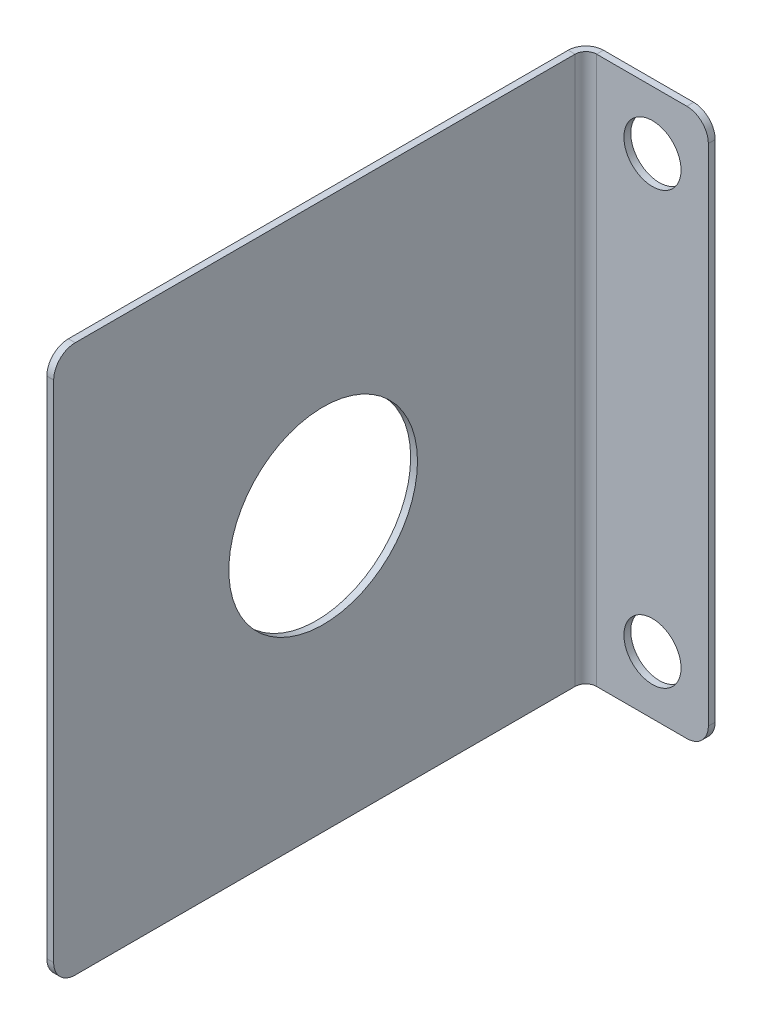
ISO-10303-21;
HEADER;
FILE_DESCRIPTION(('STEP AP214'),'2;1');
FILE_NAME('part.step','',(''),(''),'','','');
FILE_SCHEMA(('AUTOMOTIVE_DESIGN { 1 0 10303 214 1 1 1 1 }'));
ENDSEC;
DATA;
#1=APPLICATION_CONTEXT('core data for automotive mechanical design processes');
#2=APPLICATION_PROTOCOL_DEFINITION('international standard','automotive_design',2000,#1);
#3=PRODUCT_CONTEXT('',#1,'mechanical');
#4=PRODUCT('Part','Part','',(#3));
#5=PRODUCT_RELATED_PRODUCT_CATEGORY('part','',(#4));
#6=PRODUCT_DEFINITION_FORMATION('','',#4);
#7=PRODUCT_DEFINITION_CONTEXT('part definition',#1,'design');
#8=PRODUCT_DEFINITION('design','',#6,#7);
#9=PRODUCT_DEFINITION_SHAPE('','',#8);
#10=(LENGTH_UNIT() NAMED_UNIT(*) SI_UNIT(.MILLI.,.METRE.));
#11=(NAMED_UNIT(*) PLANE_ANGLE_UNIT() SI_UNIT($,.RADIAN.));
#12=(NAMED_UNIT(*) SI_UNIT($,.STERADIAN.) SOLID_ANGLE_UNIT());
#13=UNCERTAINTY_MEASURE_WITH_UNIT(LENGTH_MEASURE(1.E-05),#10,'distance_accuracy_value','');
#14=(GEOMETRIC_REPRESENTATION_CONTEXT(3) GLOBAL_UNCERTAINTY_ASSIGNED_CONTEXT((#13)) GLOBAL_UNIT_ASSIGNED_CONTEXT((#10,
#11,#12)) REPRESENTATION_CONTEXT('',''));
#15=CARTESIAN_POINT('',(0.,0.,0.));
#16=DIRECTION('',(0.,0.,1.));
#17=DIRECTION('',(1.,0.,0.));
#18=AXIS2_PLACEMENT_3D('',#15,#16,#17);
#19=CARTESIAN_POINT('',(-0.635,25.4,25.));
#20=DIRECTION('',(0.,1.,0.));
#21=DIRECTION('',(0.,0.,1.));
#22=AXIS2_PLACEMENT_3D('',#19,#20,#21);
#23=PLANE('',#22);
#24=DIRECTION('',(0.,0.,1.));
#25=VECTOR('',#24,1.);
#26=CARTESIAN_POINT('',(-0.635,25.4,25.));
#27=LINE('',#26,#25);
#28=CARTESIAN_POINT('',(-0.635000000000004,25.4,-23.365));
#29=VERTEX_POINT('',#28);
#30=CARTESIAN_POINT('',(-0.635,25.4,23.));
#31=VERTEX_POINT('',#30);
#32=EDGE_CURVE('E226',#29,#31,#27,.T.);
#33=ORIENTED_EDGE('',*,*,#32,.T.);
#34=DIRECTION('',(1.,0.,0.));
#35=VECTOR('',#34,1.);
#36=CARTESIAN_POINT('',(-0.635,25.4,23.));
#37=LINE('',#36,#35);
#38=CARTESIAN_POINT('',(0.,25.4,23.));
#39=VERTEX_POINT('',#38);
#40=EDGE_CURVE('E257',#31,#39,#37,.T.);
#41=ORIENTED_EDGE('',*,*,#40,.T.);
#42=DIRECTION('',(0.,0.,1.));
#43=VECTOR('',#42,1.);
#44=CARTESIAN_POINT('',(0.,25.4,25.));
#45=LINE('',#44,#43);
#46=CARTESIAN_POINT('',(0.,25.4,-23.365));
#47=VERTEX_POINT('',#46);
#48=EDGE_CURVE('E223',#47,#39,#45,.T.);
#49=ORIENTED_EDGE('',*,*,#48,.F.);
#50=DIRECTION('',(-1.,0.,0.));
#51=VECTOR('',#50,1.);
#52=CARTESIAN_POINT('',(0.,25.4,-23.365));
#53=LINE('',#52,#51);
#54=EDGE_CURVE('E207',#47,#29,#53,.T.);
#55=ORIENTED_EDGE('',*,*,#54,.T.);
#56=EDGE_LOOP('',(#33,#41,#49,#55));
#57=FACE_BOUND('',#56,.T.);
#58=ADVANCED_FACE('F61',(#57),#23,.T.);
#59=CARTESIAN_POINT('',(-0.635,0.,0.));
#60=DIRECTION('',(-1.,0.,0.));
#61=DIRECTION('',(0.,0.,1.));
#62=AXIS2_PLACEMENT_3D('',#59,#60,#61);
#63=PLANE('',#62);
#64=CARTESIAN_POINT('',(-0.635,0.,0.));
#65=DIRECTION('',(1.,0.,0.));
#66=DIRECTION('',(0.,0.,-1.));
#67=AXIS2_PLACEMENT_3D('',#64,#65,#66);
#68=CIRCLE('',#67,8.75);
#69=CARTESIAN_POINT('',(-0.635,0.,-8.75));
#70=VERTEX_POINT('',#69);
#71=EDGE_CURVE('E220',#70,#70,#68,.T.);
#72=ORIENTED_EDGE('',*,*,#71,.T.);
#73=EDGE_LOOP('',(#72));
#74=FACE_BOUND('',#73,.T.);
#75=DIRECTION('',(0.,-1.,0.));
#76=VECTOR('',#75,1.);
#77=CARTESIAN_POINT('',(-0.635,-25.4,25.));
#78=LINE('',#77,#76);
#79=CARTESIAN_POINT('',(-0.635,23.4,25.));
#80=VERTEX_POINT('',#79);
#81=CARTESIAN_POINT('',(-0.635,-23.4,25.));
#82=VERTEX_POINT('',#81);
#83=EDGE_CURVE('E229',#80,#82,#78,.T.);
#84=ORIENTED_EDGE('',*,*,#83,.F.);
#85=CARTESIAN_POINT('',(-0.635,23.4,23.));
#86=DIRECTION('',(-1.,0.,0.));
#87=DIRECTION('',(0.,0.,1.));
#88=AXIS2_PLACEMENT_3D('',#85,#86,#87);
#89=CIRCLE('',#88,2.);
#90=EDGE_CURVE('E69',#80,#31,#89,.T.);
#91=ORIENTED_EDGE('',*,*,#90,.T.);
#92=ORIENTED_EDGE('',*,*,#32,.F.);
#93=DIRECTION('',(0.,1.,0.));
#94=VECTOR('',#93,1.);
#95=CARTESIAN_POINT('',(-0.635000000000004,25.4,-23.365));
#96=LINE('',#95,#94);
#97=CARTESIAN_POINT('',(-0.635,-25.4,-23.365));
#98=VERTEX_POINT('',#97);
#99=EDGE_CURVE('E158',#29,#98,#96,.F.);
#100=ORIENTED_EDGE('',*,*,#99,.T.);
#101=DIRECTION('',(0.,0.,-1.));
#102=VECTOR('',#101,1.);
#103=CARTESIAN_POINT('',(-0.635,-25.4,25.));
#104=LINE('',#103,#102);
#105=CARTESIAN_POINT('',(-0.635,-25.4,23.));
#106=VERTEX_POINT('',#105);
#107=EDGE_CURVE('E232',#106,#98,#104,.T.);
#108=ORIENTED_EDGE('',*,*,#107,.F.);
#109=CARTESIAN_POINT('',(-0.635,-23.4,23.));
#110=DIRECTION('',(-1.,0.,0.));
#111=DIRECTION('',(0.,0.,1.));
#112=AXIS2_PLACEMENT_3D('',#109,#110,#111);
#113=CIRCLE('',#112,2.);
#114=EDGE_CURVE('E81',#106,#82,#113,.T.);
#115=ORIENTED_EDGE('',*,*,#114,.T.);
#116=EDGE_LOOP('',(#84,#91,#92,#100,#108,#115));
#117=FACE_BOUND('',#116,.T.);
#118=ADVANCED_FACE('F271',(#74,#117),#63,.T.);
#119=CARTESIAN_POINT('',(0.,0.,0.));
#120=DIRECTION('',(-1.,0.,0.));
#121=DIRECTION('',(0.,0.,1.));
#122=AXIS2_PLACEMENT_3D('',#119,#120,#121);
#123=PLANE('',#122);
#124=CARTESIAN_POINT('',(0.,0.,0.));
#125=DIRECTION('',(1.,0.,0.));
#126=DIRECTION('',(0.,0.,-1.));
#127=AXIS2_PLACEMENT_3D('',#124,#125,#126);
#128=CIRCLE('',#127,8.75);
#129=CARTESIAN_POINT('',(0.,0.,-8.75));
#130=VERTEX_POINT('',#129);
#131=EDGE_CURVE('E218',#130,#130,#128,.T.);
#132=ORIENTED_EDGE('',*,*,#131,.F.);
#133=EDGE_LOOP('',(#132));
#134=FACE_BOUND('',#133,.T.);
#135=ORIENTED_EDGE('',*,*,#48,.T.);
#136=CARTESIAN_POINT('',(0.,23.4,23.));
#137=DIRECTION('',(-1.,0.,0.));
#138=DIRECTION('',(0.,0.,1.));
#139=AXIS2_PLACEMENT_3D('',#136,#137,#138);
#140=CIRCLE('',#139,2.);
#141=CARTESIAN_POINT('',(0.,23.4,25.));
#142=VERTEX_POINT('',#141);
#143=EDGE_CURVE('E262',#39,#142,#140,.F.);
#144=ORIENTED_EDGE('',*,*,#143,.T.);
#145=DIRECTION('',(0.,-1.,0.));
#146=VECTOR('',#145,1.);
#147=CARTESIAN_POINT('',(0.,-25.4,25.));
#148=LINE('',#147,#146);
#149=CARTESIAN_POINT('',(0.,-23.4,25.));
#150=VERTEX_POINT('',#149);
#151=EDGE_CURVE('E237',#142,#150,#148,.T.);
#152=ORIENTED_EDGE('',*,*,#151,.T.);
#153=CARTESIAN_POINT('',(0.,-23.4,23.));
#154=DIRECTION('',(-1.,0.,0.));
#155=DIRECTION('',(0.,0.,1.));
#156=AXIS2_PLACEMENT_3D('',#153,#154,#155);
#157=CIRCLE('',#156,2.);
#158=CARTESIAN_POINT('',(0.,-25.4,23.));
#159=VERTEX_POINT('',#158);
#160=EDGE_CURVE('E260',#150,#159,#157,.F.);
#161=ORIENTED_EDGE('',*,*,#160,.T.);
#162=DIRECTION('',(0.,0.,-1.));
#163=VECTOR('',#162,1.);
#164=CARTESIAN_POINT('',(0.,-25.4,25.));
#165=LINE('',#164,#163);
#166=CARTESIAN_POINT('',(0.,-25.4,-23.365));
#167=VERTEX_POINT('',#166);
#168=EDGE_CURVE('E230',#159,#167,#165,.T.);
#169=ORIENTED_EDGE('',*,*,#168,.T.);
#170=DIRECTION('',(0.,1.,0.));
#171=VECTOR('',#170,1.);
#172=CARTESIAN_POINT('',(0.,25.4,-23.365));
#173=LINE('',#172,#171);
#174=EDGE_CURVE('E211',#47,#167,#173,.F.);
#175=ORIENTED_EDGE('',*,*,#174,.F.);
#176=EDGE_LOOP('',(#135,#144,#152,#161,#169,#175));
#177=FACE_BOUND('',#176,.T.);
#178=ADVANCED_FACE('F280',(#134,#177),#123,.F.);
#179=CARTESIAN_POINT('',(-0.635,-25.4,25.));
#180=DIRECTION('',(0.,-1.,0.));
#181=DIRECTION('',(0.,0.,-1.));
#182=AXIS2_PLACEMENT_3D('',#179,#180,#181);
#183=PLANE('',#182);
#184=ORIENTED_EDGE('',*,*,#168,.F.);
#185=DIRECTION('',(1.,0.,0.));
#186=VECTOR('',#185,1.);
#187=CARTESIAN_POINT('',(-0.635,-25.4,23.));
#188=LINE('',#187,#186);
#189=EDGE_CURVE('E13',#159,#106,#188,.F.);
#190=ORIENTED_EDGE('',*,*,#189,.T.);
#191=ORIENTED_EDGE('',*,*,#107,.T.);
#192=DIRECTION('',(-1.,0.,0.));
#193=VECTOR('',#192,1.);
#194=CARTESIAN_POINT('',(0.,-25.4,-23.365));
#195=LINE('',#194,#193);
#196=EDGE_CURVE('E215',#167,#98,#195,.T.);
#197=ORIENTED_EDGE('',*,*,#196,.F.);
#198=EDGE_LOOP('',(#184,#190,#191,#197));
#199=FACE_BOUND('',#198,.T.);
#200=ADVANCED_FACE('F287',(#199),#183,.T.);
#201=CARTESIAN_POINT('',(-0.635,-25.4,25.));
#202=DIRECTION('',(0.,0.,1.));
#203=DIRECTION('',(1.,0.,0.));
#204=AXIS2_PLACEMENT_3D('',#201,#202,#203);
#205=PLANE('',#204);
#206=ORIENTED_EDGE('',*,*,#151,.F.);
#207=DIRECTION('',(1.,0.,0.));
#208=VECTOR('',#207,1.);
#209=CARTESIAN_POINT('',(-0.635,23.4,25.));
#210=LINE('',#209,#208);
#211=EDGE_CURVE('E267',#142,#80,#210,.F.);
#212=ORIENTED_EDGE('',*,*,#211,.T.);
#213=ORIENTED_EDGE('',*,*,#83,.T.);
#214=DIRECTION('',(1.,0.,0.));
#215=VECTOR('',#214,1.);
#216=CARTESIAN_POINT('',(-0.635,-23.4,25.));
#217=LINE('',#216,#215);
#218=EDGE_CURVE('E264',#82,#150,#217,.T.);
#219=ORIENTED_EDGE('',*,*,#218,.T.);
#220=EDGE_LOOP('',(#206,#212,#213,#219));
#221=FACE_BOUND('',#220,.T.);
#222=ADVANCED_FACE('F283',(#221),#205,.T.);
#223=CARTESIAN_POINT('',(-0.635,0.,0.));
#224=DIRECTION('',(1.,0.,0.));
#225=DIRECTION('',(0.,0.,-1.));
#226=AXIS2_PLACEMENT_3D('',#223,#224,#225);
#227=CYLINDRICAL_SURFACE('',#226,8.75);
#228=ORIENTED_EDGE('',*,*,#71,.F.);
#229=EDGE_LOOP('',(#228));
#230=FACE_BOUND('',#229,.T.);
#231=ORIENTED_EDGE('',*,*,#131,.T.);
#232=EDGE_LOOP('',(#231));
#233=FACE_BOUND('',#232,.T.);
#234=ADVANCED_FACE('F454',(#230,#233),#227,.F.);
#235=CARTESIAN_POINT('',(0.999999999999997,-25.4,-23.365));
#236=DIRECTION('',(0.,-1.,0.));
#237=DIRECTION('',(0.,0.,-1.));
#238=AXIS2_PLACEMENT_3D('',#235,#236,#237);
#239=PLANE('',#238);
#240=DIRECTION('',(0.,0.,1.));
#241=VECTOR('',#240,1.);
#242=CARTESIAN_POINT('',(0.999999999999997,-25.4,-25.));
#243=LINE('',#242,#241);
#244=CARTESIAN_POINT('',(0.999999999999994,-25.4,-24.365));
#245=VERTEX_POINT('',#244);
#246=CARTESIAN_POINT('',(0.999999999999992,-25.4,-25.));
#247=VERTEX_POINT('',#246);
#248=EDGE_CURVE('E201',#245,#247,#243,.F.);
#249=ORIENTED_EDGE('',*,*,#248,.F.);
#250=CARTESIAN_POINT('',(0.999999999999997,-25.4,-23.365));
#251=DIRECTION('',(0.,1.,0.));
#252=DIRECTION('',(0.,0.,1.));
#253=AXIS2_PLACEMENT_3D('',#250,#251,#252);
#254=CIRCLE('',#253,1.);
#255=EDGE_CURVE('E161',#167,#245,#254,.F.);
#256=ORIENTED_EDGE('',*,*,#255,.F.);
#257=ORIENTED_EDGE('',*,*,#196,.T.);
#258=CARTESIAN_POINT('',(0.999999999999997,-25.4,-23.365));
#259=DIRECTION('',(0.,1.,0.));
#260=DIRECTION('',(0.,0.,1.));
#261=AXIS2_PLACEMENT_3D('',#258,#259,#260);
#262=CIRCLE('',#261,1.635);
#263=EDGE_CURVE('E206',#98,#247,#262,.F.);
#264=ORIENTED_EDGE('',*,*,#263,.T.);
#265=EDGE_LOOP('',(#249,#256,#257,#264));
#266=FACE_BOUND('',#265,.T.);
#267=ADVANCED_FACE('F291',(#266),#239,.T.);
#268=CARTESIAN_POINT('',(0.999999999999997,25.4,-23.365));
#269=DIRECTION('',(0.,-1.,0.));
#270=DIRECTION('',(0.,0.,-1.));
#271=AXIS2_PLACEMENT_3D('',#268,#269,#270);
#272=PLANE('',#271);
#273=CARTESIAN_POINT('',(0.999999999999997,25.4,-23.365));
#274=DIRECTION('',(0.,1.,0.));
#275=DIRECTION('',(0.,0.,1.));
#276=AXIS2_PLACEMENT_3D('',#273,#274,#275);
#277=CIRCLE('',#276,1.);
#278=CARTESIAN_POINT('',(0.999999999999994,25.4,-24.365));
#279=VERTEX_POINT('',#278);
#280=EDGE_CURVE('E168',#279,#47,#277,.T.);
#281=ORIENTED_EDGE('',*,*,#280,.F.);
#282=DIRECTION('',(0.,0.,1.));
#283=VECTOR('',#282,1.);
#284=CARTESIAN_POINT('',(0.999999999999997,25.4,-24.365));
#285=LINE('',#284,#283);
#286=CARTESIAN_POINT('',(0.999999999999997,25.4,-25.));
#287=VERTEX_POINT('',#286);
#288=EDGE_CURVE('E165',#279,#287,#285,.F.);
#289=ORIENTED_EDGE('',*,*,#288,.T.);
#290=CARTESIAN_POINT('',(0.999999999999997,25.4,-23.365));
#291=DIRECTION('',(0.,1.,0.));
#292=DIRECTION('',(0.,0.,1.));
#293=AXIS2_PLACEMENT_3D('',#290,#291,#292);
#294=CIRCLE('',#293,1.635);
#295=EDGE_CURVE('E150',#287,#29,#294,.T.);
#296=ORIENTED_EDGE('',*,*,#295,.T.);
#297=ORIENTED_EDGE('',*,*,#54,.F.);
#298=EDGE_LOOP('',(#281,#289,#296,#297));
#299=FACE_BOUND('',#298,.T.);
#300=ADVANCED_FACE('F166',(#299),#272,.F.);
#301=CARTESIAN_POINT('',(0.999999999999997,25.4,-23.365));
#302=DIRECTION('',(0.,1.,0.));
#303=DIRECTION('',(0.,0.,-1.));
#304=AXIS2_PLACEMENT_3D('',#301,#302,#303);
#305=CYLINDRICAL_SURFACE('',#304,1.635);
#306=ORIENTED_EDGE('',*,*,#99,.F.);
#307=ORIENTED_EDGE('',*,*,#295,.F.);
#308=DIRECTION('',(0.,1.,0.));
#309=VECTOR('',#308,1.);
#310=CARTESIAN_POINT('',(0.999999999999997,-25.4,-25.));
#311=LINE('',#310,#309);
#312=EDGE_CURVE('E155',#287,#247,#311,.F.);
#313=ORIENTED_EDGE('',*,*,#312,.T.);
#314=ORIENTED_EDGE('',*,*,#263,.F.);
#315=EDGE_LOOP('',(#306,#307,#313,#314));
#316=FACE_BOUND('',#315,.T.);
#317=ADVANCED_FACE('F152',(#316),#305,.T.);
#318=CARTESIAN_POINT('',(0.999999999999997,25.4,-23.365));
#319=DIRECTION('',(0.,1.,0.));
#320=DIRECTION('',(0.,0.,-1.));
#321=AXIS2_PLACEMENT_3D('',#318,#319,#320);
#322=CYLINDRICAL_SURFACE('',#321,1.);
#323=ORIENTED_EDGE('',*,*,#174,.T.);
#324=ORIENTED_EDGE('',*,*,#255,.T.);
#325=DIRECTION('',(0.,1.,0.));
#326=VECTOR('',#325,1.);
#327=CARTESIAN_POINT('',(0.999999999999997,-25.4,-24.365));
#328=LINE('',#327,#326);
#329=EDGE_CURVE('E173',#245,#279,#328,.T.);
#330=ORIENTED_EDGE('',*,*,#329,.T.);
#331=ORIENTED_EDGE('',*,*,#280,.T.);
#332=EDGE_LOOP('',(#323,#324,#330,#331));
#333=FACE_BOUND('',#332,.T.);
#334=ADVANCED_FACE('F294',(#333),#322,.F.);
#335=CARTESIAN_POINT('',(0.,-25.4,-25.));
#336=DIRECTION('',(0.,1.,0.));
#337=DIRECTION('',(0.,0.,1.));
#338=AXIS2_PLACEMENT_3D('',#335,#336,#337);
#339=PLANE('',#338);
#340=DIRECTION('',(-1.,0.,0.));
#341=VECTOR('',#340,1.);
#342=CARTESIAN_POINT('',(0.,-25.4,-25.));
#343=LINE('',#342,#341);
#344=CARTESIAN_POINT('',(9.365,-25.4,-25.));
#345=VERTEX_POINT('',#344);
#346=EDGE_CURVE('E182',#345,#247,#343,.T.);
#347=ORIENTED_EDGE('',*,*,#346,.F.);
#348=DIRECTION('',(0.,0.,1.));
#349=VECTOR('',#348,1.);
#350=CARTESIAN_POINT('',(9.365,-25.4,-25.));
#351=LINE('',#350,#349);
#352=CARTESIAN_POINT('',(9.365,-25.4,-24.365));
#353=VERTEX_POINT('',#352);
#354=EDGE_CURVE('E234',#345,#353,#351,.T.);
#355=ORIENTED_EDGE('',*,*,#354,.T.);
#356=DIRECTION('',(1.,0.,0.));
#357=VECTOR('',#356,1.);
#358=CARTESIAN_POINT('',(0.,-25.4,-24.365));
#359=LINE('',#358,#357);
#360=EDGE_CURVE('E183',#353,#245,#359,.F.);
#361=ORIENTED_EDGE('',*,*,#360,.T.);
#362=ORIENTED_EDGE('',*,*,#248,.T.);
#363=EDGE_LOOP('',(#347,#355,#361,#362));
#364=FACE_BOUND('',#363,.T.);
#365=ADVANCED_FACE('F311',(#364),#339,.F.);
#366=CARTESIAN_POINT('',(11.365,25.4,-25.));
#367=DIRECTION('',(0.,-1.,0.));
#368=DIRECTION('',(1.,0.,0.));
#369=AXIS2_PLACEMENT_3D('',#366,#367,#368);
#370=PLANE('',#369);
#371=DIRECTION('',(-1.,0.,0.));
#372=VECTOR('',#371,1.);
#373=CARTESIAN_POINT('',(11.365,25.4,-24.365));
#374=LINE('',#373,#372);
#375=CARTESIAN_POINT('',(9.365,25.4,-24.365));
#376=VERTEX_POINT('',#375);
#377=EDGE_CURVE('E197',#279,#376,#374,.F.);
#378=ORIENTED_EDGE('',*,*,#377,.T.);
#379=DIRECTION('',(0.,0.,1.));
#380=VECTOR('',#379,1.);
#381=CARTESIAN_POINT('',(9.365,25.4,-25.));
#382=LINE('',#381,#380);
#383=CARTESIAN_POINT('',(9.365,25.4,-25.));
#384=VERTEX_POINT('',#383);
#385=EDGE_CURVE('E187',#376,#384,#382,.F.);
#386=ORIENTED_EDGE('',*,*,#385,.T.);
#387=DIRECTION('',(1.,0.,0.));
#388=VECTOR('',#387,1.);
#389=CARTESIAN_POINT('',(0.,25.4,-25.));
#390=LINE('',#389,#388);
#391=EDGE_CURVE('E179',#287,#384,#390,.T.);
#392=ORIENTED_EDGE('',*,*,#391,.F.);
#393=ORIENTED_EDGE('',*,*,#288,.F.);
#394=EDGE_LOOP('',(#378,#386,#392,#393));
#395=FACE_BOUND('',#394,.T.);
#396=ADVANCED_FACE('F185',(#395),#370,.F.);
#397=CARTESIAN_POINT('',(0.,0.,-25.));
#398=DIRECTION('',(0.,0.,1.));
#399=DIRECTION('',(1.,0.,0.));
#400=AXIS2_PLACEMENT_3D('',#397,#398,#399);
#401=PLANE('',#400);
#402=CARTESIAN_POINT('',(6.18250000000001,-20.,-25.));
#403=DIRECTION('',(0.,0.,1.));
#404=DIRECTION('',(1.,0.,0.));
#405=AXIS2_PLACEMENT_3D('',#402,#403,#404);
#406=CIRCLE('',#405,2.65);
#407=CARTESIAN_POINT('',(8.83250000000001,-20.,-25.));
#408=VERTEX_POINT('',#407);
#409=EDGE_CURVE('E204',#408,#408,#406,.T.);
#410=ORIENTED_EDGE('',*,*,#409,.T.);
#411=EDGE_LOOP('',(#410));
#412=FACE_BOUND('',#411,.T.);
#413=CARTESIAN_POINT('',(6.18250000000001,20.,-25.));
#414=DIRECTION('',(0.,0.,1.));
#415=DIRECTION('',(1.,0.,0.));
#416=AXIS2_PLACEMENT_3D('',#413,#414,#415);
#417=CIRCLE('',#416,2.65);
#418=CARTESIAN_POINT('',(8.83250000000001,20.,-25.));
#419=VERTEX_POINT('',#418);
#420=EDGE_CURVE('E530',#419,#419,#417,.T.);
#421=ORIENTED_EDGE('',*,*,#420,.T.);
#422=EDGE_LOOP('',(#421));
#423=FACE_BOUND('',#422,.T.);
#424=DIRECTION('',(0.,-1.,0.));
#425=VECTOR('',#424,1.);
#426=CARTESIAN_POINT('',(11.365,0.,-25.));
#427=LINE('',#426,#425);
#428=CARTESIAN_POINT('',(11.365,23.4,-25.));
#429=VERTEX_POINT('',#428);
#430=CARTESIAN_POINT('',(11.365,-23.4,-25.));
#431=VERTEX_POINT('',#430);
#432=EDGE_CURVE('E188',#429,#431,#427,.T.);
#433=ORIENTED_EDGE('',*,*,#432,.T.);
#434=CARTESIAN_POINT('',(9.365,-23.4,-25.));
#435=DIRECTION('',(0.,0.,1.));
#436=DIRECTION('',(1.,0.,0.));
#437=AXIS2_PLACEMENT_3D('',#434,#435,#436);
#438=CIRCLE('',#437,2.);
#439=EDGE_CURVE('E254',#431,#345,#438,.F.);
#440=ORIENTED_EDGE('',*,*,#439,.T.);
#441=ORIENTED_EDGE('',*,*,#346,.T.);
#442=ORIENTED_EDGE('',*,*,#312,.F.);
#443=ORIENTED_EDGE('',*,*,#391,.T.);
#444=CARTESIAN_POINT('',(9.365,23.4,-25.));
#445=DIRECTION('',(0.,0.,1.));
#446=DIRECTION('',(1.,0.,0.));
#447=AXIS2_PLACEMENT_3D('',#444,#445,#446);
#448=CIRCLE('',#447,2.);
#449=EDGE_CURVE('E252',#384,#429,#448,.F.);
#450=ORIENTED_EDGE('',*,*,#449,.T.);
#451=EDGE_LOOP('',(#433,#440,#441,#442,#443,#450));
#452=FACE_BOUND('',#451,.T.);
#453=ADVANCED_FACE('F178',(#412,#423,#452),#401,.F.);
#454=CARTESIAN_POINT('',(0.,0.,-24.365));
#455=DIRECTION('',(0.,0.,1.));
#456=DIRECTION('',(1.,0.,0.));
#457=AXIS2_PLACEMENT_3D('',#454,#455,#456);
#458=PLANE('',#457);
#459=CARTESIAN_POINT('',(6.18250000000001,-20.,-24.365));
#460=DIRECTION('',(0.,0.,1.));
#461=DIRECTION('',(1.,0.,0.));
#462=AXIS2_PLACEMENT_3D('',#459,#460,#461);
#463=CIRCLE('',#462,2.65);
#464=CARTESIAN_POINT('',(8.83250000000001,-20.,-24.365));
#465=VERTEX_POINT('',#464);
#466=EDGE_CURVE('E533',#465,#465,#463,.T.);
#467=ORIENTED_EDGE('',*,*,#466,.F.);
#468=EDGE_LOOP('',(#467));
#469=FACE_BOUND('',#468,.T.);
#470=CARTESIAN_POINT('',(6.18250000000001,20.,-24.365));
#471=DIRECTION('',(0.,0.,1.));
#472=DIRECTION('',(1.,0.,0.));
#473=AXIS2_PLACEMENT_3D('',#470,#471,#472);
#474=CIRCLE('',#473,2.65);
#475=CARTESIAN_POINT('',(8.83250000000001,20.,-24.365));
#476=VERTEX_POINT('',#475);
#477=EDGE_CURVE('E531',#476,#476,#474,.T.);
#478=ORIENTED_EDGE('',*,*,#477,.F.);
#479=EDGE_LOOP('',(#478));
#480=FACE_BOUND('',#479,.T.);
#481=ORIENTED_EDGE('',*,*,#360,.F.);
#482=CARTESIAN_POINT('',(9.365,-23.4,-24.365));
#483=DIRECTION('',(0.,0.,1.));
#484=DIRECTION('',(1.,0.,0.));
#485=AXIS2_PLACEMENT_3D('',#482,#483,#484);
#486=CIRCLE('',#485,2.);
#487=CARTESIAN_POINT('',(11.365,-23.4,-24.365));
#488=VERTEX_POINT('',#487);
#489=EDGE_CURVE('E245',#353,#488,#486,.T.);
#490=ORIENTED_EDGE('',*,*,#489,.T.);
#491=DIRECTION('',(0.,1.,0.));
#492=VECTOR('',#491,1.);
#493=CARTESIAN_POINT('',(11.365,-25.4,-24.365));
#494=LINE('',#493,#492);
#495=CARTESIAN_POINT('',(11.365,23.4,-24.365));
#496=VERTEX_POINT('',#495);
#497=EDGE_CURVE('E191',#496,#488,#494,.F.);
#498=ORIENTED_EDGE('',*,*,#497,.F.);
#499=CARTESIAN_POINT('',(9.365,23.4,-24.365));
#500=DIRECTION('',(0.,0.,1.));
#501=DIRECTION('',(1.,0.,0.));
#502=AXIS2_PLACEMENT_3D('',#499,#500,#501);
#503=CIRCLE('',#502,2.);
#504=EDGE_CURVE('E243',#496,#376,#503,.T.);
#505=ORIENTED_EDGE('',*,*,#504,.T.);
#506=ORIENTED_EDGE('',*,*,#377,.F.);
#507=ORIENTED_EDGE('',*,*,#329,.F.);
#508=EDGE_LOOP('',(#481,#490,#498,#505,#506,#507));
#509=FACE_BOUND('',#508,.T.);
#510=ADVANCED_FACE('F297',(#469,#480,#509),#458,.T.);
#511=CARTESIAN_POINT('',(11.365,-25.4,-25.));
#512=DIRECTION('',(-1.,0.,0.));
#513=DIRECTION('',(0.,0.,1.));
#514=AXIS2_PLACEMENT_3D('',#511,#512,#513);
#515=PLANE('',#514);
#516=ORIENTED_EDGE('',*,*,#497,.T.);
#517=DIRECTION('',(0.,0.,1.));
#518=VECTOR('',#517,1.);
#519=CARTESIAN_POINT('',(11.365,-23.4,-25.));
#520=LINE('',#519,#518);
#521=EDGE_CURVE('E250',#488,#431,#520,.F.);
#522=ORIENTED_EDGE('',*,*,#521,.T.);
#523=ORIENTED_EDGE('',*,*,#432,.F.);
#524=DIRECTION('',(0.,0.,1.));
#525=VECTOR('',#524,1.);
#526=CARTESIAN_POINT('',(11.365,23.4,-25.));
#527=LINE('',#526,#525);
#528=EDGE_CURVE('E247',#429,#496,#527,.T.);
#529=ORIENTED_EDGE('',*,*,#528,.T.);
#530=EDGE_LOOP('',(#516,#522,#523,#529));
#531=FACE_BOUND('',#530,.T.);
#532=ADVANCED_FACE('F305',(#531),#515,.F.);
#533=CARTESIAN_POINT('',(6.18250000000001,20.,-25.));
#534=DIRECTION('',(0.,0.,1.));
#535=DIRECTION('',(1.,0.,0.));
#536=AXIS2_PLACEMENT_3D('',#533,#534,#535);
#537=CYLINDRICAL_SURFACE('',#536,2.65);
#538=ORIENTED_EDGE('',*,*,#420,.F.);
#539=EDGE_LOOP('',(#538));
#540=FACE_BOUND('',#539,.T.);
#541=ORIENTED_EDGE('',*,*,#477,.T.);
#542=EDGE_LOOP('',(#541));
#543=FACE_BOUND('',#542,.T.);
#544=ADVANCED_FACE('F369',(#540,#543),#537,.F.);
#545=CARTESIAN_POINT('',(6.18250000000001,-20.,-25.));
#546=DIRECTION('',(0.,0.,1.));
#547=DIRECTION('',(1.,0.,0.));
#548=AXIS2_PLACEMENT_3D('',#545,#546,#547);
#549=CYLINDRICAL_SURFACE('',#548,2.65);
#550=ORIENTED_EDGE('',*,*,#409,.F.);
#551=EDGE_LOOP('',(#550));
#552=FACE_BOUND('',#551,.T.);
#553=ORIENTED_EDGE('',*,*,#466,.T.);
#554=EDGE_LOOP('',(#553));
#555=FACE_BOUND('',#554,.T.);
#556=ADVANCED_FACE('F335',(#552,#555),#549,.F.);
#557=CARTESIAN_POINT('',(9.365,-23.4,-25.));
#558=DIRECTION('',(0.,0.,1.));
#559=DIRECTION('',(1.,0.,0.));
#560=AXIS2_PLACEMENT_3D('',#557,#558,#559);
#561=CYLINDRICAL_SURFACE('',#560,2.);
#562=ORIENTED_EDGE('',*,*,#439,.F.);
#563=ORIENTED_EDGE('',*,*,#521,.F.);
#564=ORIENTED_EDGE('',*,*,#489,.F.);
#565=ORIENTED_EDGE('',*,*,#354,.F.);
#566=EDGE_LOOP('',(#562,#563,#564,#565));
#567=FACE_BOUND('',#566,.T.);
#568=ADVANCED_FACE('F308',(#567),#561,.T.);
#569=CARTESIAN_POINT('',(9.365,23.4,-25.));
#570=DIRECTION('',(0.,0.,1.));
#571=DIRECTION('',(1.,0.,0.));
#572=AXIS2_PLACEMENT_3D('',#569,#570,#571);
#573=CYLINDRICAL_SURFACE('',#572,2.);
#574=ORIENTED_EDGE('',*,*,#449,.F.);
#575=ORIENTED_EDGE('',*,*,#385,.F.);
#576=ORIENTED_EDGE('',*,*,#504,.F.);
#577=ORIENTED_EDGE('',*,*,#528,.F.);
#578=EDGE_LOOP('',(#574,#575,#576,#577));
#579=FACE_BOUND('',#578,.T.);
#580=ADVANCED_FACE('F300',(#579),#573,.T.);
#581=CARTESIAN_POINT('',(-0.635,23.4,23.));
#582=DIRECTION('',(1.,0.,0.));
#583=DIRECTION('',(0.,0.,-1.));
#584=AXIS2_PLACEMENT_3D('',#581,#582,#583);
#585=CYLINDRICAL_SURFACE('',#584,2.);
#586=ORIENTED_EDGE('',*,*,#90,.F.);
#587=ORIENTED_EDGE('',*,*,#211,.F.);
#588=ORIENTED_EDGE('',*,*,#143,.F.);
#589=ORIENTED_EDGE('',*,*,#40,.F.);
#590=EDGE_LOOP('',(#586,#587,#588,#589));
#591=FACE_BOUND('',#590,.T.);
#592=ADVANCED_FACE('F277',(#591),#585,.T.);
#593=CARTESIAN_POINT('',(-0.635,-23.4,23.));
#594=DIRECTION('',(1.,0.,0.));
#595=DIRECTION('',(0.,0.,-1.));
#596=AXIS2_PLACEMENT_3D('',#593,#594,#595);
#597=CYLINDRICAL_SURFACE('',#596,2.);
#598=ORIENTED_EDGE('',*,*,#114,.F.);
#599=ORIENTED_EDGE('',*,*,#189,.F.);
#600=ORIENTED_EDGE('',*,*,#160,.F.);
#601=ORIENTED_EDGE('',*,*,#218,.F.);
#602=EDGE_LOOP('',(#598,#599,#600,#601));
#603=FACE_BOUND('',#602,.T.);
#604=ADVANCED_FACE('F63',(#603),#597,.T.);
#605=CLOSED_SHELL('',(#58,#118,#178,#200,#222,#234,#267,#300,#317,#334,#365,#396,#453,#510,#532,
#544,#556,#568,#580,#592,#604));
#606=MANIFOLD_SOLID_BREP('B2',#605);
#607=ADVANCED_BREP_SHAPE_REPRESENTATION('',(#18,#606),#14);
#608=SHAPE_DEFINITION_REPRESENTATION(#9,#607);
ENDSEC;
END-ISO-10303-21;
